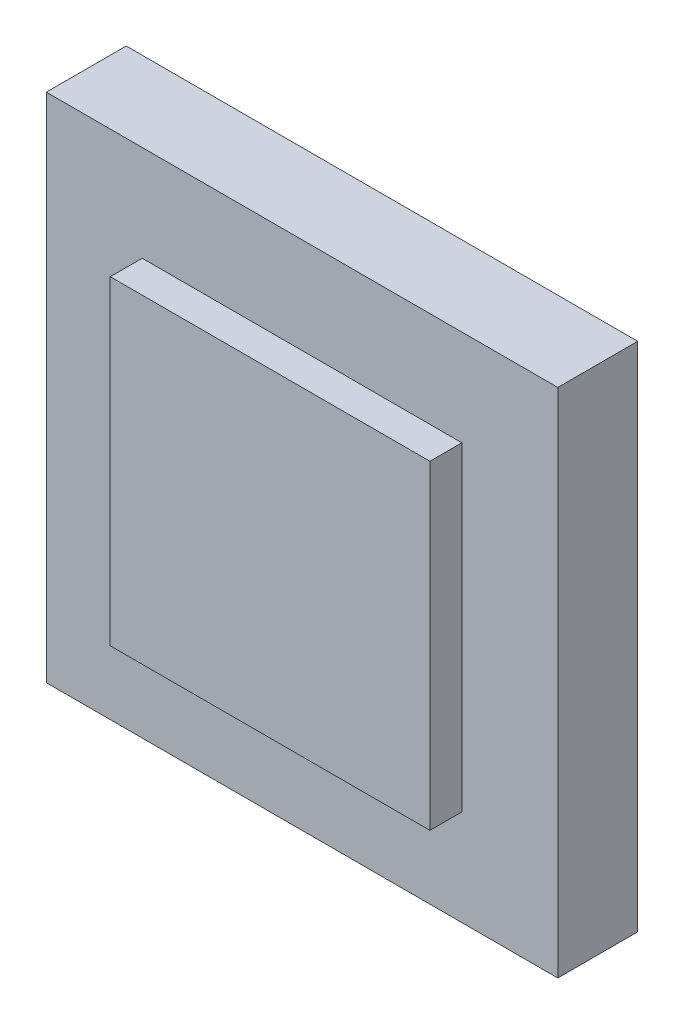
ISO-10303-21;
HEADER;
FILE_DESCRIPTION(('STEP AP214'),'2;1');
FILE_NAME('part.step','',(''),(''),'','','');
FILE_SCHEMA(('AUTOMOTIVE_DESIGN { 1 0 10303 214 1 1 1 1 }'));
ENDSEC;
DATA;
#1=APPLICATION_CONTEXT('core data for automotive mechanical design processes');
#2=APPLICATION_PROTOCOL_DEFINITION('international standard','automotive_design',2000,#1);
#3=PRODUCT_CONTEXT('',#1,'mechanical');
#4=PRODUCT('Part','Part','',(#3));
#5=PRODUCT_RELATED_PRODUCT_CATEGORY('part','',(#4));
#6=PRODUCT_DEFINITION_FORMATION('','',#4);
#7=PRODUCT_DEFINITION_CONTEXT('part definition',#1,'design');
#8=PRODUCT_DEFINITION('design','',#6,#7);
#9=PRODUCT_DEFINITION_SHAPE('','',#8);
#10=(LENGTH_UNIT() NAMED_UNIT(*) SI_UNIT(.MILLI.,.METRE.));
#11=(NAMED_UNIT(*) PLANE_ANGLE_UNIT() SI_UNIT($,.RADIAN.));
#12=(NAMED_UNIT(*) SI_UNIT($,.STERADIAN.) SOLID_ANGLE_UNIT());
#13=UNCERTAINTY_MEASURE_WITH_UNIT(LENGTH_MEASURE(1.E-05),#10,'distance_accuracy_value','');
#14=(GEOMETRIC_REPRESENTATION_CONTEXT(3) GLOBAL_UNCERTAINTY_ASSIGNED_CONTEXT((#13)) GLOBAL_UNIT_ASSIGNED_CONTEXT((#10,
#11,#12)) REPRESENTATION_CONTEXT('',''));
#15=CARTESIAN_POINT('',(0.,0.,0.));
#16=DIRECTION('',(0.,0.,1.));
#17=DIRECTION('',(1.,0.,0.));
#18=AXIS2_PLACEMENT_3D('',#15,#16,#17);
#19=CARTESIAN_POINT('',(0.,0.,63.5));
#20=DIRECTION('',(0.,0.,-1.));
#21=DIRECTION('',(-1.,0.,0.));
#22=AXIS2_PLACEMENT_3D('',#19,#20,#21);
#23=PLANE('',#22);
#24=DIRECTION('',(0.,1.,0.));
#25=VECTOR('',#24,1.);
#26=CARTESIAN_POINT('',(203.2,-203.2,63.5));
#27=LINE('',#26,#25);
#28=CARTESIAN_POINT('',(203.2,-203.2,63.5));
#29=VERTEX_POINT('',#28);
#30=CARTESIAN_POINT('',(203.2,203.2,63.5));
#31=VERTEX_POINT('',#30);
#32=EDGE_CURVE('E149',#29,#31,#27,.T.);
#33=ORIENTED_EDGE('',*,*,#32,.T.);
#34=DIRECTION('',(-1.,0.,0.));
#35=VECTOR('',#34,1.);
#36=CARTESIAN_POINT('',(-203.2,203.2,63.5));
#37=LINE('',#36,#35);
#38=CARTESIAN_POINT('',(-203.2,203.2,63.5));
#39=VERTEX_POINT('',#38);
#40=EDGE_CURVE('E153',#31,#39,#37,.T.);
#41=ORIENTED_EDGE('',*,*,#40,.T.);
#42=DIRECTION('',(0.,-1.,0.));
#43=VECTOR('',#42,1.);
#44=CARTESIAN_POINT('',(-203.2,-203.2,63.5));
#45=LINE('',#44,#43);
#46=CARTESIAN_POINT('',(-203.2,-203.2,63.5));
#47=VERTEX_POINT('',#46);
#48=EDGE_CURVE('E157',#39,#47,#45,.T.);
#49=ORIENTED_EDGE('',*,*,#48,.T.);
#50=DIRECTION('',(1.,0.,0.));
#51=VECTOR('',#50,1.);
#52=CARTESIAN_POINT('',(-203.2,-203.2,63.5));
#53=LINE('',#52,#51);
#54=EDGE_CURVE('E160',#47,#29,#53,.T.);
#55=ORIENTED_EDGE('',*,*,#54,.T.);
#56=EDGE_LOOP('',(#33,#41,#49,#55));
#57=FACE_BOUND('',#56,.T.);
#58=DIRECTION('',(0.,1.,0.));
#59=VECTOR('',#58,1.);
#60=CARTESIAN_POINT('',(127.,-127.,63.5));
#61=LINE('',#60,#59);
#62=CARTESIAN_POINT('',(127.,-127.,63.5));
#63=VERTEX_POINT('',#62);
#64=CARTESIAN_POINT('',(127.,127.,63.5));
#65=VERTEX_POINT('',#64);
#66=EDGE_CURVE('E65',#63,#65,#61,.T.);
#67=ORIENTED_EDGE('',*,*,#66,.F.);
#68=DIRECTION('',(1.,0.,0.));
#69=VECTOR('',#68,1.);
#70=CARTESIAN_POINT('',(-127.,-127.,63.5));
#71=LINE('',#70,#69);
#72=CARTESIAN_POINT('',(-127.,-127.,63.5));
#73=VERTEX_POINT('',#72);
#74=EDGE_CURVE('E69',#73,#63,#71,.T.);
#75=ORIENTED_EDGE('',*,*,#74,.F.);
#76=DIRECTION('',(0.,-1.,0.));
#77=VECTOR('',#76,1.);
#78=CARTESIAN_POINT('',(-127.,-127.,63.5));
#79=LINE('',#78,#77);
#80=CARTESIAN_POINT('',(-127.,127.,63.5));
#81=VERTEX_POINT('',#80);
#82=EDGE_CURVE('E337',#81,#73,#79,.T.);
#83=ORIENTED_EDGE('',*,*,#82,.F.);
#84=DIRECTION('',(-1.,0.,0.));
#85=VECTOR('',#84,1.);
#86=CARTESIAN_POINT('',(-127.,127.,63.5));
#87=LINE('',#86,#85);
#88=EDGE_CURVE('E347',#65,#81,#87,.T.);
#89=ORIENTED_EDGE('',*,*,#88,.F.);
#90=EDGE_LOOP('',(#67,#75,#83,#89));
#91=FACE_BOUND('',#90,.T.);
#92=ADVANCED_FACE('F49',(#57,#91),#23,.F.);
#93=CARTESIAN_POINT('',(203.2,-203.2,63.5));
#94=DIRECTION('',(-1.,0.,0.));
#95=DIRECTION('',(0.,0.,1.));
#96=AXIS2_PLACEMENT_3D('',#93,#94,#95);
#97=PLANE('',#96);
#98=DIRECTION('',(0.,1.,0.));
#99=VECTOR('',#98,1.);
#100=CARTESIAN_POINT('',(203.2,-203.2,0.));
#101=LINE('',#100,#99);
#102=CARTESIAN_POINT('',(203.2,-203.2,0.));
#103=VERTEX_POINT('',#102);
#104=CARTESIAN_POINT('',(203.2,203.2,0.));
#105=VERTEX_POINT('',#104);
#106=EDGE_CURVE('E138',#103,#105,#101,.T.);
#107=ORIENTED_EDGE('',*,*,#106,.T.);
#108=DIRECTION('',(0.,0.,-1.));
#109=VECTOR('',#108,1.);
#110=CARTESIAN_POINT('',(203.2,203.2,63.5));
#111=LINE('',#110,#109);
#112=EDGE_CURVE('E11',#31,#105,#111,.T.);
#113=ORIENTED_EDGE('',*,*,#112,.F.);
#114=ORIENTED_EDGE('',*,*,#32,.F.);
#115=DIRECTION('',(0.,0.,-1.));
#116=VECTOR('',#115,1.);
#117=CARTESIAN_POINT('',(203.2,-203.2,63.5));
#118=LINE('',#117,#116);
#119=EDGE_CURVE('E162',#29,#103,#118,.T.);
#120=ORIENTED_EDGE('',*,*,#119,.T.);
#121=EDGE_LOOP('',(#107,#113,#114,#120));
#122=FACE_BOUND('',#121,.T.);
#123=ADVANCED_FACE('F51',(#122),#97,.F.);
#124=CARTESIAN_POINT('',(-203.2,203.2,63.5));
#125=DIRECTION('',(0.,-1.,0.));
#126=DIRECTION('',(0.,0.,-1.));
#127=AXIS2_PLACEMENT_3D('',#124,#125,#126);
#128=PLANE('',#127);
#129=DIRECTION('',(-1.,0.,0.));
#130=VECTOR('',#129,1.);
#131=CARTESIAN_POINT('',(-203.2,203.2,0.));
#132=LINE('',#131,#130);
#133=CARTESIAN_POINT('',(-203.2,203.2,0.));
#134=VERTEX_POINT('',#133);
#135=EDGE_CURVE('E143',#105,#134,#132,.T.);
#136=ORIENTED_EDGE('',*,*,#135,.T.);
#137=DIRECTION('',(0.,0.,-1.));
#138=VECTOR('',#137,1.);
#139=CARTESIAN_POINT('',(-203.2,203.2,63.5));
#140=LINE('',#139,#138);
#141=EDGE_CURVE('E58',#39,#134,#140,.T.);
#142=ORIENTED_EDGE('',*,*,#141,.F.);
#143=ORIENTED_EDGE('',*,*,#40,.F.);
#144=ORIENTED_EDGE('',*,*,#112,.T.);
#145=EDGE_LOOP('',(#136,#142,#143,#144));
#146=FACE_BOUND('',#145,.T.);
#147=ADVANCED_FACE('F198',(#146),#128,.F.);
#148=CARTESIAN_POINT('',(-203.2,-203.2,63.5));
#149=DIRECTION('',(1.,0.,0.));
#150=DIRECTION('',(0.,0.,-1.));
#151=AXIS2_PLACEMENT_3D('',#148,#149,#150);
#152=PLANE('',#151);
#153=DIRECTION('',(0.,-1.,0.));
#154=VECTOR('',#153,1.);
#155=CARTESIAN_POINT('',(-203.2,-203.2,0.));
#156=LINE('',#155,#154);
#157=CARTESIAN_POINT('',(-203.2,-203.2,0.));
#158=VERTEX_POINT('',#157);
#159=EDGE_CURVE('E166',#134,#158,#156,.T.);
#160=ORIENTED_EDGE('',*,*,#159,.T.);
#161=DIRECTION('',(0.,0.,-1.));
#162=VECTOR('',#161,1.);
#163=CARTESIAN_POINT('',(-203.2,-203.2,63.5));
#164=LINE('',#163,#162);
#165=EDGE_CURVE('E174',#47,#158,#164,.T.);
#166=ORIENTED_EDGE('',*,*,#165,.F.);
#167=ORIENTED_EDGE('',*,*,#48,.F.);
#168=ORIENTED_EDGE('',*,*,#141,.T.);
#169=EDGE_LOOP('',(#160,#166,#167,#168));
#170=FACE_BOUND('',#169,.T.);
#171=ADVANCED_FACE('F183',(#170),#152,.F.);
#172=CARTESIAN_POINT('',(-203.2,-203.2,63.5));
#173=DIRECTION('',(0.,1.,0.));
#174=DIRECTION('',(0.,0.,1.));
#175=AXIS2_PLACEMENT_3D('',#172,#173,#174);
#176=PLANE('',#175);
#177=DIRECTION('',(1.,0.,0.));
#178=VECTOR('',#177,1.);
#179=CARTESIAN_POINT('',(-203.2,-203.2,0.));
#180=LINE('',#179,#178);
#181=EDGE_CURVE('E154',#158,#103,#180,.T.);
#182=ORIENTED_EDGE('',*,*,#181,.T.);
#183=ORIENTED_EDGE('',*,*,#119,.F.);
#184=ORIENTED_EDGE('',*,*,#54,.F.);
#185=ORIENTED_EDGE('',*,*,#165,.T.);
#186=EDGE_LOOP('',(#182,#183,#184,#185));
#187=FACE_BOUND('',#186,.T.);
#188=ADVANCED_FACE('F192',(#187),#176,.F.);
#189=CARTESIAN_POINT('',(0.,0.,0.));
#190=DIRECTION('',(0.,0.,-1.));
#191=DIRECTION('',(-1.,0.,0.));
#192=AXIS2_PLACEMENT_3D('',#189,#190,#191);
#193=PLANE('',#192);
#194=ORIENTED_EDGE('',*,*,#106,.F.);
#195=ORIENTED_EDGE('',*,*,#181,.F.);
#196=ORIENTED_EDGE('',*,*,#159,.F.);
#197=ORIENTED_EDGE('',*,*,#135,.F.);
#198=EDGE_LOOP('',(#194,#195,#196,#197));
#199=FACE_BOUND('',#198,.T.);
#200=ADVANCED_FACE('F189',(#199),#193,.T.);
#201=CARTESIAN_POINT('',(127.,-127.,88.9));
#202=DIRECTION('',(-1.,0.,0.));
#203=DIRECTION('',(0.,0.,1.));
#204=AXIS2_PLACEMENT_3D('',#201,#202,#203);
#205=PLANE('',#204);
#206=ORIENTED_EDGE('',*,*,#66,.T.);
#207=DIRECTION('',(0.,0.,-1.));
#208=VECTOR('',#207,1.);
#209=CARTESIAN_POINT('',(127.,127.,88.9));
#210=LINE('',#209,#208);
#211=CARTESIAN_POINT('',(127.,127.,88.9));
#212=VERTEX_POINT('',#211);
#213=EDGE_CURVE('E118',#212,#65,#210,.T.);
#214=ORIENTED_EDGE('',*,*,#213,.F.);
#215=DIRECTION('',(0.,1.,0.));
#216=VECTOR('',#215,1.);
#217=CARTESIAN_POINT('',(127.,-127.,88.9));
#218=LINE('',#217,#216);
#219=CARTESIAN_POINT('',(127.,-127.,88.9));
#220=VERTEX_POINT('',#219);
#221=EDGE_CURVE('E125',#220,#212,#218,.T.);
#222=ORIENTED_EDGE('',*,*,#221,.F.);
#223=DIRECTION('',(0.,0.,-1.));
#224=VECTOR('',#223,1.);
#225=CARTESIAN_POINT('',(127.,-127.,88.9));
#226=LINE('',#225,#224);
#227=EDGE_CURVE('E334',#220,#63,#226,.T.);
#228=ORIENTED_EDGE('',*,*,#227,.T.);
#229=EDGE_LOOP('',(#206,#214,#222,#228));
#230=FACE_BOUND('',#229,.T.);
#231=ADVANCED_FACE('F136',(#230),#205,.F.);
#232=CARTESIAN_POINT('',(-127.,127.,88.9));
#233=DIRECTION('',(0.,-1.,0.));
#234=DIRECTION('',(0.,0.,-1.));
#235=AXIS2_PLACEMENT_3D('',#232,#233,#234);
#236=PLANE('',#235);
#237=ORIENTED_EDGE('',*,*,#88,.T.);
#238=DIRECTION('',(0.,0.,-1.));
#239=VECTOR('',#238,1.);
#240=CARTESIAN_POINT('',(-127.,127.,88.9));
#241=LINE('',#240,#239);
#242=CARTESIAN_POINT('',(-127.,127.,88.9));
#243=VERTEX_POINT('',#242);
#244=EDGE_CURVE('E120',#243,#81,#241,.T.);
#245=ORIENTED_EDGE('',*,*,#244,.F.);
#246=DIRECTION('',(-1.,0.,0.));
#247=VECTOR('',#246,1.);
#248=CARTESIAN_POINT('',(-127.,127.,88.9));
#249=LINE('',#248,#247);
#250=EDGE_CURVE('E113',#212,#243,#249,.T.);
#251=ORIENTED_EDGE('',*,*,#250,.F.);
#252=ORIENTED_EDGE('',*,*,#213,.T.);
#253=EDGE_LOOP('',(#237,#245,#251,#252));
#254=FACE_BOUND('',#253,.T.);
#255=ADVANCED_FACE('F116',(#254),#236,.F.);
#256=CARTESIAN_POINT('',(-127.,-127.,88.9));
#257=DIRECTION('',(1.,0.,0.));
#258=DIRECTION('',(0.,0.,-1.));
#259=AXIS2_PLACEMENT_3D('',#256,#257,#258);
#260=PLANE('',#259);
#261=ORIENTED_EDGE('',*,*,#82,.T.);
#262=DIRECTION('',(0.,0.,-1.));
#263=VECTOR('',#262,1.);
#264=CARTESIAN_POINT('',(-127.,-127.,88.9));
#265=LINE('',#264,#263);
#266=CARTESIAN_POINT('',(-127.,-127.,88.9));
#267=VERTEX_POINT('',#266);
#268=EDGE_CURVE('E145',#267,#73,#265,.T.);
#269=ORIENTED_EDGE('',*,*,#268,.F.);
#270=DIRECTION('',(0.,-1.,0.));
#271=VECTOR('',#270,1.);
#272=CARTESIAN_POINT('',(-127.,-127.,88.9));
#273=LINE('',#272,#271);
#274=EDGE_CURVE('E124',#243,#267,#273,.T.);
#275=ORIENTED_EDGE('',*,*,#274,.F.);
#276=ORIENTED_EDGE('',*,*,#244,.T.);
#277=EDGE_LOOP('',(#261,#269,#275,#276));
#278=FACE_BOUND('',#277,.T.);
#279=ADVANCED_FACE('F234',(#278),#260,.F.);
#280=CARTESIAN_POINT('',(-127.,-127.,88.9));
#281=DIRECTION('',(0.,1.,0.));
#282=DIRECTION('',(0.,0.,1.));
#283=AXIS2_PLACEMENT_3D('',#280,#281,#282);
#284=PLANE('',#283);
#285=ORIENTED_EDGE('',*,*,#74,.T.);
#286=ORIENTED_EDGE('',*,*,#227,.F.);
#287=DIRECTION('',(1.,0.,0.));
#288=VECTOR('',#287,1.);
#289=CARTESIAN_POINT('',(-127.,-127.,88.9));
#290=LINE('',#289,#288);
#291=EDGE_CURVE('E130',#267,#220,#290,.T.);
#292=ORIENTED_EDGE('',*,*,#291,.F.);
#293=ORIENTED_EDGE('',*,*,#268,.T.);
#294=EDGE_LOOP('',(#285,#286,#292,#293));
#295=FACE_BOUND('',#294,.T.);
#296=ADVANCED_FACE('F240',(#295),#284,.F.);
#297=CARTESIAN_POINT('',(0.,0.,88.9));
#298=DIRECTION('',(0.,0.,-1.));
#299=DIRECTION('',(-1.,0.,0.));
#300=AXIS2_PLACEMENT_3D('',#297,#298,#299);
#301=PLANE('',#300);
#302=ORIENTED_EDGE('',*,*,#221,.T.);
#303=ORIENTED_EDGE('',*,*,#250,.T.);
#304=ORIENTED_EDGE('',*,*,#274,.T.);
#305=ORIENTED_EDGE('',*,*,#291,.T.);
#306=EDGE_LOOP('',(#302,#303,#304,#305));
#307=FACE_BOUND('',#306,.T.);
#308=ADVANCED_FACE('F128',(#307),#301,.F.);
#309=CLOSED_SHELL('',(#92,#123,#147,#171,#188,#200,#231,#255,#279,#296,#308));
#310=MANIFOLD_SOLID_BREP('B2',#309);
#311=ADVANCED_BREP_SHAPE_REPRESENTATION('',(#18,#310),#14);
#312=SHAPE_DEFINITION_REPRESENTATION(#9,#311);
ENDSEC;
END-ISO-10303-21;
